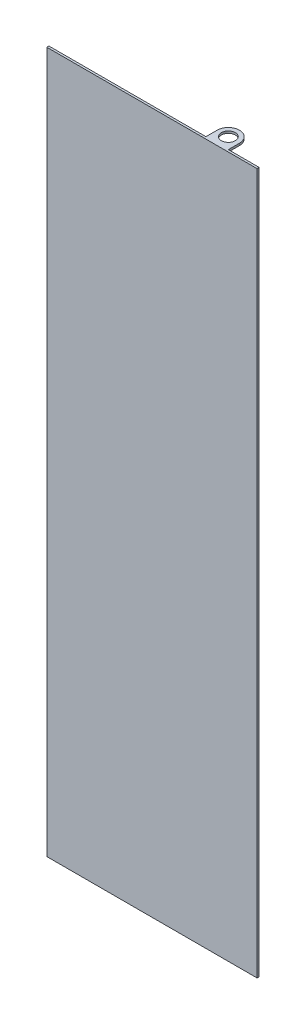
ISO-10303-21;
HEADER;
FILE_DESCRIPTION(('STEP AP214'),'2;1');
FILE_NAME('part.step','',(''),(''),'','','');
FILE_SCHEMA(('AUTOMOTIVE_DESIGN { 1 0 10303 214 1 1 1 1 }'));
ENDSEC;
DATA;
#1=APPLICATION_CONTEXT('core data for automotive mechanical design processes');
#2=APPLICATION_PROTOCOL_DEFINITION('international standard','automotive_design',2000,#1);
#3=PRODUCT_CONTEXT('',#1,'mechanical');
#4=PRODUCT('Part','Part','',(#3));
#5=PRODUCT_RELATED_PRODUCT_CATEGORY('part','',(#4));
#6=PRODUCT_DEFINITION_FORMATION('','',#4);
#7=PRODUCT_DEFINITION_CONTEXT('part definition',#1,'design');
#8=PRODUCT_DEFINITION('design','',#6,#7);
#9=PRODUCT_DEFINITION_SHAPE('','',#8);
#10=(LENGTH_UNIT() NAMED_UNIT(*) SI_UNIT(.MILLI.,.METRE.));
#11=(NAMED_UNIT(*) PLANE_ANGLE_UNIT() SI_UNIT($,.RADIAN.));
#12=(NAMED_UNIT(*) SI_UNIT($,.STERADIAN.) SOLID_ANGLE_UNIT());
#13=UNCERTAINTY_MEASURE_WITH_UNIT(LENGTH_MEASURE(1.E-05),#10,'distance_accuracy_value','');
#14=(GEOMETRIC_REPRESENTATION_CONTEXT(3) GLOBAL_UNCERTAINTY_ASSIGNED_CONTEXT((#13)) GLOBAL_UNIT_ASSIGNED_CONTEXT((#10,
#11,#12)) REPRESENTATION_CONTEXT('',''));
#15=CARTESIAN_POINT('',(0.,0.,0.));
#16=DIRECTION('',(0.,0.,1.));
#17=DIRECTION('',(1.,0.,0.));
#18=AXIS2_PLACEMENT_3D('',#15,#16,#17);
#19=CARTESIAN_POINT('',(0.,0.,0.));
#20=DIRECTION('',(0.,0.,1.));
#21=DIRECTION('',(1.,0.,0.));
#22=AXIS2_PLACEMENT_3D('',#19,#20,#21);
#23=PLANE('',#22);
#24=DIRECTION('',(0.,1.,0.));
#25=VECTOR('',#24,1.);
#26=CARTESIAN_POINT('',(37.,248.5,0.));
#27=LINE('',#26,#25);
#28=CARTESIAN_POINT('',(37.,248.5,0.));
#29=VERTEX_POINT('',#28);
#30=CARTESIAN_POINT('',(37.,250.,0.));
#31=VERTEX_POINT('',#30);
#32=EDGE_CURVE('E133',#29,#31,#27,.T.);
#33=ORIENTED_EDGE('',*,*,#32,.F.);
#34=DIRECTION('',(1.,0.,0.));
#35=VECTOR('',#34,1.);
#36=CARTESIAN_POINT('',(53.,248.5,0.));
#37=LINE('',#36,#35);
#38=CARTESIAN_POINT('',(53.,248.5,0.));
#39=VERTEX_POINT('',#38);
#40=EDGE_CURVE('E126',#29,#39,#37,.T.);
#41=ORIENTED_EDGE('',*,*,#40,.T.);
#42=DIRECTION('',(0.,1.,0.));
#43=VECTOR('',#42,1.);
#44=CARTESIAN_POINT('',(53.,248.5,0.));
#45=LINE('',#44,#43);
#46=CARTESIAN_POINT('',(53.,250.,0.));
#47=VERTEX_POINT('',#46);
#48=EDGE_CURVE('E112',#39,#47,#45,.T.);
#49=ORIENTED_EDGE('',*,*,#48,.T.);
#50=DIRECTION('',(-1.,0.,0.));
#51=VECTOR('',#50,1.);
#52=CARTESIAN_POINT('',(-75.,250.,0.));
#53=LINE('',#52,#51);
#54=CARTESIAN_POINT('',(75.,250.,0.));
#55=VERTEX_POINT('',#54);
#56=EDGE_CURVE('E164',#55,#47,#53,.T.);
#57=ORIENTED_EDGE('',*,*,#56,.F.);
#58=DIRECTION('',(0.,1.,0.));
#59=VECTOR('',#58,1.);
#60=CARTESIAN_POINT('',(75.,250.,0.));
#61=LINE('',#60,#59);
#62=CARTESIAN_POINT('',(75.,-250.,0.));
#63=VERTEX_POINT('',#62);
#64=EDGE_CURVE('E150',#63,#55,#61,.T.);
#65=ORIENTED_EDGE('',*,*,#64,.F.);
#66=DIRECTION('',(1.,0.,0.));
#67=VECTOR('',#66,1.);
#68=CARTESIAN_POINT('',(-75.,-250.,0.));
#69=LINE('',#68,#67);
#70=CARTESIAN_POINT('',(-75.,-250.,0.));
#71=VERTEX_POINT('',#70);
#72=EDGE_CURVE('E85',#71,#63,#69,.T.);
#73=ORIENTED_EDGE('',*,*,#72,.F.);
#74=DIRECTION('',(0.,-1.,0.));
#75=VECTOR('',#74,1.);
#76=CARTESIAN_POINT('',(-75.,250.,0.));
#77=LINE('',#76,#75);
#78=CARTESIAN_POINT('',(-75.,250.,0.));
#79=VERTEX_POINT('',#78);
#80=EDGE_CURVE('E166',#79,#71,#77,.T.);
#81=ORIENTED_EDGE('',*,*,#80,.F.);
#82=EDGE_CURVE('E163',#31,#79,#53,.T.);
#83=ORIENTED_EDGE('',*,*,#82,.F.);
#84=EDGE_LOOP('',(#33,#41,#49,#57,#65,#73,#81,#83));
#85=FACE_BOUND('',#84,.T.);
#86=ADVANCED_FACE('F40',(#85),#23,.F.);
#87=CARTESIAN_POINT('',(75.,250.,1.5));
#88=DIRECTION('',(-1.,0.,0.));
#89=DIRECTION('',(0.,-1.,0.));
#90=AXIS2_PLACEMENT_3D('',#87,#88,#89);
#91=PLANE('',#90);
#92=ORIENTED_EDGE('',*,*,#64,.T.);
#93=DIRECTION('',(0.,0.,-1.));
#94=VECTOR('',#93,1.);
#95=CARTESIAN_POINT('',(75.,250.,1.5));
#96=LINE('',#95,#94);
#97=CARTESIAN_POINT('',(75.,250.,1.5));
#98=VERTEX_POINT('',#97);
#99=EDGE_CURVE('E11',#98,#55,#96,.T.);
#100=ORIENTED_EDGE('',*,*,#99,.F.);
#101=DIRECTION('',(0.,1.,0.));
#102=VECTOR('',#101,1.);
#103=CARTESIAN_POINT('',(75.,250.,1.5));
#104=LINE('',#103,#102);
#105=CARTESIAN_POINT('',(75.,-250.,1.5));
#106=VERTEX_POINT('',#105);
#107=EDGE_CURVE('E154',#106,#98,#104,.T.);
#108=ORIENTED_EDGE('',*,*,#107,.F.);
#109=DIRECTION('',(0.,0.,-1.));
#110=VECTOR('',#109,1.);
#111=CARTESIAN_POINT('',(75.,-250.,1.5));
#112=LINE('',#111,#110);
#113=EDGE_CURVE('E160',#106,#63,#112,.T.);
#114=ORIENTED_EDGE('',*,*,#113,.T.);
#115=EDGE_LOOP('',(#92,#100,#108,#114));
#116=FACE_BOUND('',#115,.T.);
#117=ADVANCED_FACE('F42',(#116),#91,.F.);
#118=CARTESIAN_POINT('',(-75.,250.,1.5));
#119=DIRECTION('',(0.,-1.,0.));
#120=DIRECTION('',(0.,0.,-1.));
#121=AXIS2_PLACEMENT_3D('',#118,#119,#120);
#122=PLANE('',#121);
#123=ORIENTED_EDGE('',*,*,#56,.T.);
#124=DIRECTION('',(0.,0.,-1.));
#125=VECTOR('',#124,1.);
#126=CARTESIAN_POINT('',(53.,250.,0.));
#127=LINE('',#126,#125);
#128=CARTESIAN_POINT('',(53.,250.,-8.));
#129=VERTEX_POINT('',#128);
#130=EDGE_CURVE('E55',#47,#129,#127,.T.);
#131=ORIENTED_EDGE('',*,*,#130,.T.);
#132=CARTESIAN_POINT('',(45.,250.,-8.));
#133=DIRECTION('',(0.,1.,0.));
#134=DIRECTION('',(0.,0.,1.));
#135=AXIS2_PLACEMENT_3D('',#132,#133,#134);
#136=CIRCLE('',#135,8.);
#137=CARTESIAN_POINT('',(37.,250.,-8.));
#138=VERTEX_POINT('',#137);
#139=EDGE_CURVE('E137',#129,#138,#136,.T.);
#140=ORIENTED_EDGE('',*,*,#139,.T.);
#141=DIRECTION('',(0.,0.,1.));
#142=VECTOR('',#141,1.);
#143=CARTESIAN_POINT('',(37.,250.,0.));
#144=LINE('',#143,#142);
#145=EDGE_CURVE('E134',#138,#31,#144,.T.);
#146=ORIENTED_EDGE('',*,*,#145,.T.);
#147=ORIENTED_EDGE('',*,*,#82,.T.);
#148=DIRECTION('',(0.,0.,-1.));
#149=VECTOR('',#148,1.);
#150=CARTESIAN_POINT('',(-75.,250.,1.5));
#151=LINE('',#150,#149);
#152=CARTESIAN_POINT('',(-75.,250.,1.5));
#153=VERTEX_POINT('',#152);
#154=EDGE_CURVE('E48',#153,#79,#151,.T.);
#155=ORIENTED_EDGE('',*,*,#154,.F.);
#156=DIRECTION('',(-1.,0.,0.));
#157=VECTOR('',#156,1.);
#158=CARTESIAN_POINT('',(-75.,250.,1.5));
#159=LINE('',#158,#157);
#160=EDGE_CURVE('E92',#98,#153,#159,.T.);
#161=ORIENTED_EDGE('',*,*,#160,.F.);
#162=ORIENTED_EDGE('',*,*,#99,.T.);
#163=EDGE_LOOP('',(#123,#131,#140,#146,#147,#155,#161,#162));
#164=FACE_BOUND('',#163,.T.);
#165=CARTESIAN_POINT('',(45.,250.,-8.));
#166=DIRECTION('',(0.,1.,0.));
#167=DIRECTION('',(0.,0.,1.));
#168=AXIS2_PLACEMENT_3D('',#165,#166,#167);
#169=CIRCLE('',#168,5.);
#170=CARTESIAN_POINT('',(45.,250.,-3.));
#171=VERTEX_POINT('',#170);
#172=EDGE_CURVE('E140',#171,#171,#169,.T.);
#173=ORIENTED_EDGE('',*,*,#172,.F.);
#174=EDGE_LOOP('',(#173));
#175=FACE_BOUND('',#174,.T.);
#176=ADVANCED_FACE('F191',(#164,#175),#122,.F.);
#177=CARTESIAN_POINT('',(-75.,250.,1.5));
#178=DIRECTION('',(1.,0.,0.));
#179=DIRECTION('',(0.,1.,0.));
#180=AXIS2_PLACEMENT_3D('',#177,#178,#179);
#181=PLANE('',#180);
#182=ORIENTED_EDGE('',*,*,#80,.T.);
#183=DIRECTION('',(0.,0.,-1.));
#184=VECTOR('',#183,1.);
#185=CARTESIAN_POINT('',(-75.,-250.,1.5));
#186=LINE('',#185,#184);
#187=CARTESIAN_POINT('',(-75.,-250.,1.5));
#188=VERTEX_POINT('',#187);
#189=EDGE_CURVE('E170',#188,#71,#186,.T.);
#190=ORIENTED_EDGE('',*,*,#189,.F.);
#191=DIRECTION('',(0.,-1.,0.));
#192=VECTOR('',#191,1.);
#193=CARTESIAN_POINT('',(-75.,250.,1.5));
#194=LINE('',#193,#192);
#195=EDGE_CURVE('E157',#153,#188,#194,.T.);
#196=ORIENTED_EDGE('',*,*,#195,.F.);
#197=ORIENTED_EDGE('',*,*,#154,.T.);
#198=EDGE_LOOP('',(#182,#190,#196,#197));
#199=FACE_BOUND('',#198,.T.);
#200=ADVANCED_FACE('F175',(#199),#181,.F.);
#201=CARTESIAN_POINT('',(-75.,-250.,1.5));
#202=DIRECTION('',(0.,1.,0.));
#203=DIRECTION('',(0.,0.,1.));
#204=AXIS2_PLACEMENT_3D('',#201,#202,#203);
#205=PLANE('',#204);
#206=ORIENTED_EDGE('',*,*,#72,.T.);
#207=ORIENTED_EDGE('',*,*,#113,.F.);
#208=DIRECTION('',(1.,0.,0.));
#209=VECTOR('',#208,1.);
#210=CARTESIAN_POINT('',(-75.,-250.,1.5));
#211=LINE('',#210,#209);
#212=EDGE_CURVE('E64',#188,#106,#211,.T.);
#213=ORIENTED_EDGE('',*,*,#212,.F.);
#214=ORIENTED_EDGE('',*,*,#189,.T.);
#215=EDGE_LOOP('',(#206,#207,#213,#214));
#216=FACE_BOUND('',#215,.T.);
#217=ADVANCED_FACE('F181',(#216),#205,.F.);
#218=CARTESIAN_POINT('',(0.,0.,1.5));
#219=DIRECTION('',(0.,0.,1.));
#220=DIRECTION('',(1.,0.,0.));
#221=AXIS2_PLACEMENT_3D('',#218,#219,#220);
#222=PLANE('',#221);
#223=ORIENTED_EDGE('',*,*,#107,.T.);
#224=ORIENTED_EDGE('',*,*,#160,.T.);
#225=ORIENTED_EDGE('',*,*,#195,.T.);
#226=ORIENTED_EDGE('',*,*,#212,.T.);
#227=EDGE_LOOP('',(#223,#224,#225,#226));
#228=FACE_BOUND('',#227,.T.);
#229=ADVANCED_FACE('F183',(#228),#222,.T.);
#230=CARTESIAN_POINT('',(37.,248.5,0.));
#231=DIRECTION('',(-1.,0.,0.));
#232=DIRECTION('',(0.,0.,1.));
#233=AXIS2_PLACEMENT_3D('',#230,#231,#232);
#234=PLANE('',#233);
#235=ORIENTED_EDGE('',*,*,#145,.F.);
#236=DIRECTION('',(0.,1.,0.));
#237=VECTOR('',#236,1.);
#238=CARTESIAN_POINT('',(37.,248.5,-8.));
#239=LINE('',#238,#237);
#240=CARTESIAN_POINT('',(37.,248.5,-8.));
#241=VERTEX_POINT('',#240);
#242=EDGE_CURVE('E151',#241,#138,#239,.T.);
#243=ORIENTED_EDGE('',*,*,#242,.F.);
#244=DIRECTION('',(0.,0.,1.));
#245=VECTOR('',#244,1.);
#246=CARTESIAN_POINT('',(37.,248.5,0.));
#247=LINE('',#246,#245);
#248=EDGE_CURVE('E120',#241,#29,#247,.T.);
#249=ORIENTED_EDGE('',*,*,#248,.T.);
#250=ORIENTED_EDGE('',*,*,#32,.T.);
#251=EDGE_LOOP('',(#235,#243,#249,#250));
#252=FACE_BOUND('',#251,.T.);
#253=ADVANCED_FACE('F189',(#252),#234,.T.);
#254=CARTESIAN_POINT('',(45.,248.5,-8.));
#255=DIRECTION('',(0.,1.,0.));
#256=DIRECTION('',(0.,0.,1.));
#257=AXIS2_PLACEMENT_3D('',#254,#255,#256);
#258=CYLINDRICAL_SURFACE('',#257,8.);
#259=ORIENTED_EDGE('',*,*,#139,.F.);
#260=DIRECTION('',(0.,1.,0.));
#261=VECTOR('',#260,1.);
#262=CARTESIAN_POINT('',(53.,248.5,-8.));
#263=LINE('',#262,#261);
#264=CARTESIAN_POINT('',(53.,248.5,-8.));
#265=VERTEX_POINT('',#264);
#266=EDGE_CURVE('E119',#265,#129,#263,.T.);
#267=ORIENTED_EDGE('',*,*,#266,.F.);
#268=CARTESIAN_POINT('',(45.,248.5,-8.));
#269=DIRECTION('',(0.,1.,0.));
#270=DIRECTION('',(0.,0.,1.));
#271=AXIS2_PLACEMENT_3D('',#268,#269,#270);
#272=CIRCLE('',#271,8.);
#273=EDGE_CURVE('E129',#265,#241,#272,.T.);
#274=ORIENTED_EDGE('',*,*,#273,.T.);
#275=ORIENTED_EDGE('',*,*,#242,.T.);
#276=EDGE_LOOP('',(#259,#267,#274,#275));
#277=FACE_BOUND('',#276,.T.);
#278=ADVANCED_FACE('F201',(#277),#258,.T.);
#279=CARTESIAN_POINT('',(53.,248.5,0.));
#280=DIRECTION('',(1.,0.,0.));
#281=DIRECTION('',(0.,0.,-1.));
#282=AXIS2_PLACEMENT_3D('',#279,#280,#281);
#283=PLANE('',#282);
#284=ORIENTED_EDGE('',*,*,#130,.F.);
#285=ORIENTED_EDGE('',*,*,#48,.F.);
#286=DIRECTION('',(0.,0.,-1.));
#287=VECTOR('',#286,1.);
#288=CARTESIAN_POINT('',(53.,248.5,0.));
#289=LINE('',#288,#287);
#290=EDGE_CURVE('E115',#39,#265,#289,.T.);
#291=ORIENTED_EDGE('',*,*,#290,.T.);
#292=ORIENTED_EDGE('',*,*,#266,.T.);
#293=EDGE_LOOP('',(#284,#285,#291,#292));
#294=FACE_BOUND('',#293,.T.);
#295=ADVANCED_FACE('F114',(#294),#283,.T.);
#296=CARTESIAN_POINT('',(45.,248.5,-8.));
#297=DIRECTION('',(0.,1.,0.));
#298=DIRECTION('',(0.,0.,1.));
#299=AXIS2_PLACEMENT_3D('',#296,#297,#298);
#300=PLANE('',#299);
#301=CARTESIAN_POINT('',(45.,248.5,-8.));
#302=DIRECTION('',(0.,1.,0.));
#303=DIRECTION('',(0.,0.,1.));
#304=AXIS2_PLACEMENT_3D('',#301,#302,#303);
#305=CIRCLE('',#304,5.);
#306=CARTESIAN_POINT('',(45.,248.5,-3.));
#307=VERTEX_POINT('',#306);
#308=EDGE_CURVE('E146',#307,#307,#305,.T.);
#309=ORIENTED_EDGE('',*,*,#308,.T.);
#310=EDGE_LOOP('',(#309));
#311=FACE_BOUND('',#310,.T.);
#312=ORIENTED_EDGE('',*,*,#40,.F.);
#313=ORIENTED_EDGE('',*,*,#248,.F.);
#314=ORIENTED_EDGE('',*,*,#273,.F.);
#315=ORIENTED_EDGE('',*,*,#290,.F.);
#316=EDGE_LOOP('',(#312,#313,#314,#315));
#317=FACE_BOUND('',#316,.T.);
#318=ADVANCED_FACE('F124',(#311,#317),#300,.F.);
#319=CARTESIAN_POINT('',(45.,248.5,-8.));
#320=DIRECTION('',(0.,1.,0.));
#321=DIRECTION('',(0.,0.,1.));
#322=AXIS2_PLACEMENT_3D('',#319,#320,#321);
#323=CYLINDRICAL_SURFACE('',#322,5.);
#324=ORIENTED_EDGE('',*,*,#308,.F.);
#325=EDGE_LOOP('',(#324));
#326=FACE_BOUND('',#325,.T.);
#327=ORIENTED_EDGE('',*,*,#172,.T.);
#328=EDGE_LOOP('',(#327));
#329=FACE_BOUND('',#328,.T.);
#330=ADVANCED_FACE('F210',(#326,#329),#323,.F.);
#331=CLOSED_SHELL('',(#86,#117,#176,#200,#217,#229,#253,#278,#295,#318,#330));
#332=MANIFOLD_SOLID_BREP('B2',#331);
#333=ADVANCED_BREP_SHAPE_REPRESENTATION('',(#18,#332),#14);
#334=SHAPE_DEFINITION_REPRESENTATION(#9,#333);
ENDSEC;
END-ISO-10303-21;
